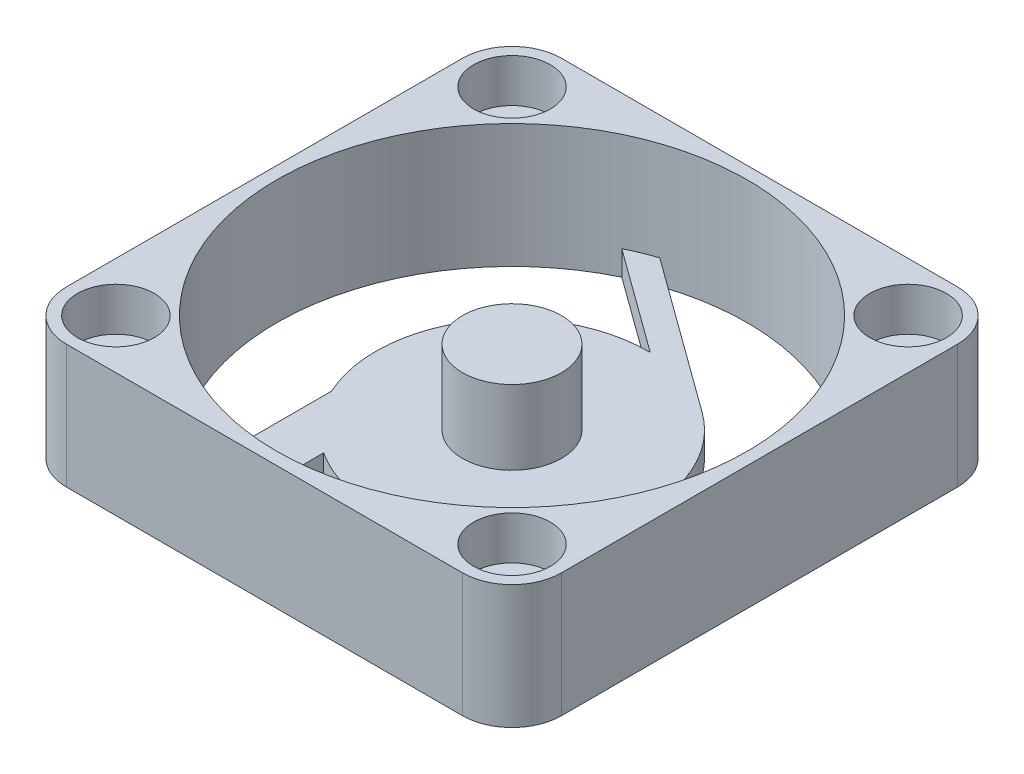
ISO-10303-21;
HEADER;
FILE_DESCRIPTION(('STEP AP214'),'2;1');
FILE_NAME('part.step','',(''),(''),'','','');
FILE_SCHEMA(('AUTOMOTIVE_DESIGN { 1 0 10303 214 1 1 1 1 }'));
ENDSEC;
DATA;
#1=APPLICATION_CONTEXT('core data for automotive mechanical design processes');
#2=APPLICATION_PROTOCOL_DEFINITION('international standard','automotive_design',2000,#1);
#3=PRODUCT_CONTEXT('',#1,'mechanical');
#4=PRODUCT('Part','Part','',(#3));
#5=PRODUCT_RELATED_PRODUCT_CATEGORY('part','',(#4));
#6=PRODUCT_DEFINITION_FORMATION('','',#4);
#7=PRODUCT_DEFINITION_CONTEXT('part definition',#1,'design');
#8=PRODUCT_DEFINITION('design','',#6,#7);
#9=PRODUCT_DEFINITION_SHAPE('','',#8);
#10=(LENGTH_UNIT() NAMED_UNIT(*) SI_UNIT(.MILLI.,.METRE.));
#11=(NAMED_UNIT(*) PLANE_ANGLE_UNIT() SI_UNIT($,.RADIAN.));
#12=(NAMED_UNIT(*) SI_UNIT($,.STERADIAN.) SOLID_ANGLE_UNIT());
#13=UNCERTAINTY_MEASURE_WITH_UNIT(LENGTH_MEASURE(1.E-05),#10,'distance_accuracy_value','');
#14=(GEOMETRIC_REPRESENTATION_CONTEXT(3) GLOBAL_UNCERTAINTY_ASSIGNED_CONTEXT((#13)) GLOBAL_UNIT_ASSIGNED_CONTEXT((#10,
#11,#12)) REPRESENTATION_CONTEXT('',''));
#15=CARTESIAN_POINT('',(0.,0.,0.));
#16=DIRECTION('',(0.,0.,1.));
#17=DIRECTION('',(1.,0.,0.));
#18=AXIS2_PLACEMENT_3D('',#15,#16,#17);
#19=CARTESIAN_POINT('',(0.,2.,0.));
#20=DIRECTION('',(0.,1.,0.));
#21=DIRECTION('',(0.,0.,1.));
#22=AXIS2_PLACEMENT_3D('',#19,#20,#21);
#23=PLANE('',#22);
#24=DIRECTION('',(-0.809016994374951,0.,-0.587785252292468));
#25=VECTOR('',#24,1.);
#26=CARTESIAN_POINT('',(-8.24737632897294,2.,-17.1166814449617));
#27=LINE('',#26,#25);
#28=CARTESIAN_POINT('',(0.173394534615489,2.,-10.9986332939764));
#29=VERTEX_POINT('',#28);
#30=CARTESIAN_POINT('',(-8.24737632897294,2.,-17.1166814449617));
#31=VERTEX_POINT('',#30);
#32=EDGE_CURVE('E189',#29,#31,#27,.T.);
#33=ORIENTED_EDGE('',*,*,#32,.F.);
#34=CARTESIAN_POINT('',(0.,2.,0.));
#35=DIRECTION('',(0.,-1.,0.));
#36=DIRECTION('',(0.,0.,1.));
#37=AXIS2_PLACEMENT_3D('',#34,#35,#36);
#38=CIRCLE('',#37,11.);
#39=CARTESIAN_POINT('',(-10.,2.,4.58257569495584));
#40=VERTEX_POINT('',#39);
#41=EDGE_CURVE('E173',#40,#29,#38,.T.);
#42=ORIENTED_EDGE('',*,*,#41,.F.);
#43=DIRECTION('',(0.,0.,-1.));
#44=VECTOR('',#43,1.);
#45=CARTESIAN_POINT('',(-10.,2.,4.58257569495584));
#46=LINE('',#45,#44);
#47=CARTESIAN_POINT('',(-10.,2.,16.1554944214035));
#48=VERTEX_POINT('',#47);
#49=EDGE_CURVE('E180',#48,#40,#46,.T.);
#50=ORIENTED_EDGE('',*,*,#49,.F.);
#51=CARTESIAN_POINT('',(0.,2.,0.));
#52=DIRECTION('',(0.,1.,0.));
#53=DIRECTION('',(0.,0.,1.));
#54=AXIS2_PLACEMENT_3D('',#51,#52,#53);
#55=CIRCLE('',#54,19.);
#56=CARTESIAN_POINT('',(-6.,2.,18.0277563773199));
#57=VERTEX_POINT('',#56);
#58=EDGE_CURVE('E246',#48,#57,#55,.T.);
#59=ORIENTED_EDGE('',*,*,#58,.T.);
#60=DIRECTION('',(0.,0.,1.));
#61=VECTOR('',#60,1.);
#62=CARTESIAN_POINT('',(-6.,2.,9.21954445729289));
#63=LINE('',#62,#61);
#64=CARTESIAN_POINT('',(-6.,2.,9.21954445729289));
#65=VERTEX_POINT('',#64);
#66=EDGE_CURVE('E211',#65,#57,#63,.T.);
#67=ORIENTED_EDGE('',*,*,#66,.F.);
#68=CARTESIAN_POINT('',(0.,2.,0.));
#69=DIRECTION('',(0.,-1.,0.));
#70=DIRECTION('',(0.,0.,1.));
#71=AXIS2_PLACEMENT_3D('',#68,#69,#70);
#72=CIRCLE('',#71,11.);
#73=CARTESIAN_POINT('',(5.49999999999999,2.,9.52627944162883));
#74=VERTEX_POINT('',#73);
#75=EDGE_CURVE('E208',#74,#65,#72,.T.);
#76=ORIENTED_EDGE('',*,*,#75,.F.);
#77=DIRECTION('',(-0.866025403784439,0.,0.499999999999999));
#78=VECTOR('',#77,1.);
#79=CARTESIAN_POINT('',(5.49999999999999,2.,9.52627944162883));
#80=LINE('',#79,#78);
#81=CARTESIAN_POINT('',(18.9164078649987,2.,1.78031274921401));
#82=VERTEX_POINT('',#81);
#83=EDGE_CURVE('E205',#82,#74,#80,.T.);
#84=ORIENTED_EDGE('',*,*,#83,.F.);
#85=CARTESIAN_POINT('',(18.9913767461894,2.,-0.572371631280806));
#86=VERTEX_POINT('',#85);
#87=EDGE_CURVE('E243',#82,#86,#55,.T.);
#88=ORIENTED_EDGE('',*,*,#87,.T.);
#89=DIRECTION('',(0.866025403784438,0.,-0.5));
#90=VECTOR('',#89,1.);
#91=CARTESIAN_POINT('',(18.9913767461894,2.,-0.572371631280806));
#92=LINE('',#91,#90);
#93=CARTESIAN_POINT('',(9.97722557505166,2.,4.63195097389157));
#94=VERTEX_POINT('',#93);
#95=EDGE_CURVE('E263',#94,#86,#92,.T.);
#96=ORIENTED_EDGE('',*,*,#95,.F.);
#97=CARTESIAN_POINT('',(0.,2.,0.));
#98=DIRECTION('',(0.,-1.,0.));
#99=DIRECTION('',(0.,0.,1.));
#100=AXIS2_PLACEMENT_3D('',#97,#98,#99);
#101=CIRCLE('',#100,11.);
#102=CARTESIAN_POINT('',(6.46563777521722,2.,-8.89918693812441));
#103=VERTEX_POINT('',#102);
#104=EDGE_CURVE('E235',#103,#94,#101,.T.);
#105=ORIENTED_EDGE('',*,*,#104,.F.);
#106=DIRECTION('',(0.809016994374947,0.,0.587785252292474));
#107=VECTOR('',#106,1.);
#108=CARTESIAN_POINT('',(6.46563777521722,2.,-8.89918693812441));
#109=LINE('',#108,#107);
#110=CARTESIAN_POINT('',(-6.06759960883458,2.,-18.0051169112247));
#111=VERTEX_POINT('',#110);
#112=EDGE_CURVE('E232',#111,#103,#109,.T.);
#113=ORIENTED_EDGE('',*,*,#112,.F.);
#114=EDGE_CURVE('E252',#111,#31,#55,.T.);
#115=ORIENTED_EDGE('',*,*,#114,.T.);
#116=EDGE_LOOP('',(#33,#42,#50,#59,#67,#76,#84,#88,#96,#105,#113,#115));
#117=FACE_BOUND('',#116,.T.);
#118=CARTESIAN_POINT('',(0.,2.,0.));
#119=DIRECTION('',(0.,1.,0.));
#120=DIRECTION('',(0.,0.,1.));
#121=AXIS2_PLACEMENT_3D('',#118,#119,#120);
#122=CIRCLE('',#121,4.);
#123=CARTESIAN_POINT('',(0.,2.,4.));
#124=VERTEX_POINT('',#123);
#125=EDGE_CURVE('E527',#124,#124,#122,.T.);
#126=ORIENTED_EDGE('',*,*,#125,.F.);
#127=EDGE_LOOP('',(#126));
#128=FACE_BOUND('',#127,.T.);
#129=ADVANCED_FACE('F34',(#117,#128),#23,.T.);
#130=CARTESIAN_POINT('',(-16.,-2.50000000007189E-05,16.));
#131=DIRECTION('',(0.,1.,0.));
#132=DIRECTION('',(0.,0.,1.));
#133=AXIS2_PLACEMENT_3D('',#130,#131,#132);
#134=CYLINDRICAL_SURFACE('',#133,1.75);
#135=CARTESIAN_POINT('',(-16.,0.,16.));
#136=DIRECTION('',(0.,-1.,0.));
#137=DIRECTION('',(0.,0.,-1.));
#138=AXIS2_PLACEMENT_3D('',#135,#136,#137);
#139=CIRCLE('',#138,1.75);
#140=CARTESIAN_POINT('',(-16.,0.,14.25));
#141=VERTEX_POINT('',#140);
#142=EDGE_CURVE('E572',#141,#141,#139,.T.);
#143=ORIENTED_EDGE('',*,*,#142,.T.);
#144=EDGE_LOOP('',(#143));
#145=FACE_BOUND('',#144,.T.);
#146=CARTESIAN_POINT('',(-16.,6.5,16.));
#147=DIRECTION('',(0.,1.,0.));
#148=DIRECTION('',(0.,0.,1.));
#149=AXIS2_PLACEMENT_3D('',#146,#147,#148);
#150=CIRCLE('',#149,1.75);
#151=CARTESIAN_POINT('',(-16.,6.5,17.75));
#152=VERTEX_POINT('',#151);
#153=EDGE_CURVE('E38',#152,#152,#150,.F.);
#154=ORIENTED_EDGE('',*,*,#153,.F.);
#155=EDGE_LOOP('',(#154));
#156=FACE_BOUND('',#155,.T.);
#157=ADVANCED_FACE('F392',(#145,#156),#134,.F.);
#158=CARTESIAN_POINT('',(16.,-2.50000000007189E-05,16.));
#159=DIRECTION('',(0.,1.,0.));
#160=DIRECTION('',(0.,0.,1.));
#161=AXIS2_PLACEMENT_3D('',#158,#159,#160);
#162=CYLINDRICAL_SURFACE('',#161,1.75);
#163=CARTESIAN_POINT('',(16.,0.,16.));
#164=DIRECTION('',(0.,-1.,0.));
#165=DIRECTION('',(0.,0.,-1.));
#166=AXIS2_PLACEMENT_3D('',#163,#164,#165);
#167=CIRCLE('',#166,1.75);
#168=CARTESIAN_POINT('',(16.,0.,14.25));
#169=VERTEX_POINT('',#168);
#170=EDGE_CURVE('E569',#169,#169,#167,.T.);
#171=ORIENTED_EDGE('',*,*,#170,.T.);
#172=EDGE_LOOP('',(#171));
#173=FACE_BOUND('',#172,.T.);
#174=CARTESIAN_POINT('',(16.,6.5,16.));
#175=DIRECTION('',(0.,1.,0.));
#176=DIRECTION('',(0.,0.,1.));
#177=AXIS2_PLACEMENT_3D('',#174,#175,#176);
#178=CIRCLE('',#177,1.75);
#179=CARTESIAN_POINT('',(16.,6.5,17.75));
#180=VERTEX_POINT('',#179);
#181=EDGE_CURVE('E540',#180,#180,#178,.F.);
#182=ORIENTED_EDGE('',*,*,#181,.F.);
#183=EDGE_LOOP('',(#182));
#184=FACE_BOUND('',#183,.T.);
#185=ADVANCED_FACE('F397',(#173,#184),#162,.F.);
#186=CARTESIAN_POINT('',(16.,-2.50000000007189E-05,-16.));
#187=DIRECTION('',(0.,1.,0.));
#188=DIRECTION('',(0.,0.,1.));
#189=AXIS2_PLACEMENT_3D('',#186,#187,#188);
#190=CYLINDRICAL_SURFACE('',#189,1.75);
#191=CARTESIAN_POINT('',(16.,0.,-16.));
#192=DIRECTION('',(0.,-1.,0.));
#193=DIRECTION('',(0.,0.,-1.));
#194=AXIS2_PLACEMENT_3D('',#191,#192,#193);
#195=CIRCLE('',#194,1.75);
#196=CARTESIAN_POINT('',(16.,0.,-17.75));
#197=VERTEX_POINT('',#196);
#198=EDGE_CURVE('E575',#197,#197,#195,.T.);
#199=ORIENTED_EDGE('',*,*,#198,.T.);
#200=EDGE_LOOP('',(#199));
#201=FACE_BOUND('',#200,.T.);
#202=CARTESIAN_POINT('',(16.,6.5,-16.));
#203=DIRECTION('',(0.,1.,0.));
#204=DIRECTION('',(0.,0.,1.));
#205=AXIS2_PLACEMENT_3D('',#202,#203,#204);
#206=CIRCLE('',#205,1.75);
#207=CARTESIAN_POINT('',(16.,6.5,-14.25));
#208=VERTEX_POINT('',#207);
#209=EDGE_CURVE('E547',#208,#208,#206,.F.);
#210=ORIENTED_EDGE('',*,*,#209,.F.);
#211=EDGE_LOOP('',(#210));
#212=FACE_BOUND('',#211,.T.);
#213=ADVANCED_FACE('F469',(#201,#212),#190,.F.);
#214=CARTESIAN_POINT('',(-16.,-2.50000000007189E-05,-16.));
#215=DIRECTION('',(0.,1.,0.));
#216=DIRECTION('',(0.,0.,1.));
#217=AXIS2_PLACEMENT_3D('',#214,#215,#216);
#218=CYLINDRICAL_SURFACE('',#217,1.75);
#219=CARTESIAN_POINT('',(-16.,0.,-16.));
#220=DIRECTION('',(0.,-1.,0.));
#221=DIRECTION('',(0.,0.,-1.));
#222=AXIS2_PLACEMENT_3D('',#219,#220,#221);
#223=CIRCLE('',#222,1.75);
#224=CARTESIAN_POINT('',(-16.,0.,-17.75));
#225=VERTEX_POINT('',#224);
#226=EDGE_CURVE('E184',#225,#225,#223,.T.);
#227=ORIENTED_EDGE('',*,*,#226,.T.);
#228=EDGE_LOOP('',(#227));
#229=FACE_BOUND('',#228,.T.);
#230=CARTESIAN_POINT('',(-16.,6.5,-16.));
#231=DIRECTION('',(0.,1.,0.));
#232=DIRECTION('',(0.,0.,1.));
#233=AXIS2_PLACEMENT_3D('',#230,#231,#232);
#234=CIRCLE('',#233,1.75);
#235=CARTESIAN_POINT('',(-16.,6.5,-14.25));
#236=VERTEX_POINT('',#235);
#237=EDGE_CURVE('E553',#236,#236,#234,.F.);
#238=ORIENTED_EDGE('',*,*,#237,.F.);
#239=EDGE_LOOP('',(#238));
#240=FACE_BOUND('',#239,.T.);
#241=ADVANCED_FACE('F441',(#229,#240),#218,.F.);
#242=CARTESIAN_POINT('',(-16.,10.,16.));
#243=DIRECTION('',(0.,-1.,0.));
#244=DIRECTION('',(0.,0.,-1.));
#245=AXIS2_PLACEMENT_3D('',#242,#243,#244);
#246=CYLINDRICAL_SURFACE('',#245,4.);
#247=CARTESIAN_POINT('',(-16.,0.,16.));
#248=DIRECTION('',(0.,1.,0.));
#249=DIRECTION('',(0.,0.,-1.));
#250=AXIS2_PLACEMENT_3D('',#247,#248,#249);
#251=CIRCLE('',#250,4.);
#252=CARTESIAN_POINT('',(-20.,0.,16.));
#253=VERTEX_POINT('',#252);
#254=CARTESIAN_POINT('',(-16.,0.,20.));
#255=VERTEX_POINT('',#254);
#256=EDGE_CURVE('E256',#253,#255,#251,.T.);
#257=ORIENTED_EDGE('',*,*,#256,.T.);
#258=DIRECTION('',(0.,-1.,0.));
#259=VECTOR('',#258,1.);
#260=CARTESIAN_POINT('',(-16.,10.,20.));
#261=LINE('',#260,#259);
#262=CARTESIAN_POINT('',(-16.,10.,20.));
#263=VERTEX_POINT('',#262);
#264=EDGE_CURVE('E333',#263,#255,#261,.T.);
#265=ORIENTED_EDGE('',*,*,#264,.F.);
#266=CARTESIAN_POINT('',(-16.,10.,16.));
#267=DIRECTION('',(0.,1.,0.));
#268=DIRECTION('',(0.,0.,-1.));
#269=AXIS2_PLACEMENT_3D('',#266,#267,#268);
#270=CIRCLE('',#269,4.);
#271=CARTESIAN_POINT('',(-20.,10.,16.));
#272=VERTEX_POINT('',#271);
#273=EDGE_CURVE('E279',#272,#263,#270,.T.);
#274=ORIENTED_EDGE('',*,*,#273,.F.);
#275=DIRECTION('',(0.,-1.,0.));
#276=VECTOR('',#275,1.);
#277=CARTESIAN_POINT('',(-20.,10.,16.));
#278=LINE('',#277,#276);
#279=EDGE_CURVE('E297',#272,#253,#278,.T.);
#280=ORIENTED_EDGE('',*,*,#279,.T.);
#281=EDGE_LOOP('',(#257,#265,#274,#280));
#282=FACE_BOUND('',#281,.T.);
#283=ADVANCED_FACE('F36',(#282),#246,.T.);
#284=CARTESIAN_POINT('',(16.,10.,20.));
#285=DIRECTION('',(0.,0.,-1.));
#286=DIRECTION('',(-1.,0.,0.));
#287=AXIS2_PLACEMENT_3D('',#284,#285,#286);
#288=PLANE('',#287);
#289=DIRECTION('',(1.,0.,0.));
#290=VECTOR('',#289,1.);
#291=CARTESIAN_POINT('',(16.,0.,20.));
#292=LINE('',#291,#290);
#293=CARTESIAN_POINT('',(16.,0.,20.));
#294=VERTEX_POINT('',#293);
#295=EDGE_CURVE('E300',#255,#294,#292,.T.);
#296=ORIENTED_EDGE('',*,*,#295,.T.);
#297=DIRECTION('',(0.,-1.,0.));
#298=VECTOR('',#297,1.);
#299=CARTESIAN_POINT('',(16.,10.,20.));
#300=LINE('',#299,#298);
#301=CARTESIAN_POINT('',(16.,10.,20.));
#302=VERTEX_POINT('',#301);
#303=EDGE_CURVE('E330',#302,#294,#300,.T.);
#304=ORIENTED_EDGE('',*,*,#303,.F.);
#305=DIRECTION('',(1.,0.,0.));
#306=VECTOR('',#305,1.);
#307=CARTESIAN_POINT('',(16.,10.,20.));
#308=LINE('',#307,#306);
#309=EDGE_CURVE('E282',#263,#302,#308,.T.);
#310=ORIENTED_EDGE('',*,*,#309,.F.);
#311=ORIENTED_EDGE('',*,*,#264,.T.);
#312=EDGE_LOOP('',(#296,#304,#310,#311));
#313=FACE_BOUND('',#312,.T.);
#314=ADVANCED_FACE('F434',(#313),#288,.F.);
#315=CARTESIAN_POINT('',(16.,10.,16.));
#316=DIRECTION('',(0.,-1.,0.));
#317=DIRECTION('',(0.,0.,-1.));
#318=AXIS2_PLACEMENT_3D('',#315,#316,#317);
#319=CYLINDRICAL_SURFACE('',#318,4.);
#320=CARTESIAN_POINT('',(16.,0.,16.));
#321=DIRECTION('',(0.,1.,0.));
#322=DIRECTION('',(0.,0.,1.));
#323=AXIS2_PLACEMENT_3D('',#320,#321,#322);
#324=CIRCLE('',#323,4.);
#325=CARTESIAN_POINT('',(20.,0.,16.));
#326=VERTEX_POINT('',#325);
#327=EDGE_CURVE('E302',#294,#326,#324,.T.);
#328=ORIENTED_EDGE('',*,*,#327,.T.);
#329=DIRECTION('',(0.,-1.,0.));
#330=VECTOR('',#329,1.);
#331=CARTESIAN_POINT('',(20.,10.,16.));
#332=LINE('',#331,#330);
#333=CARTESIAN_POINT('',(20.,10.,16.));
#334=VERTEX_POINT('',#333);
#335=EDGE_CURVE('E327',#334,#326,#332,.T.);
#336=ORIENTED_EDGE('',*,*,#335,.F.);
#337=CARTESIAN_POINT('',(16.,10.,16.));
#338=DIRECTION('',(0.,1.,0.));
#339=DIRECTION('',(0.,0.,1.));
#340=AXIS2_PLACEMENT_3D('',#337,#338,#339);
#341=CIRCLE('',#340,4.);
#342=EDGE_CURVE('E285',#302,#334,#341,.T.);
#343=ORIENTED_EDGE('',*,*,#342,.F.);
#344=ORIENTED_EDGE('',*,*,#303,.T.);
#345=EDGE_LOOP('',(#328,#336,#343,#344));
#346=FACE_BOUND('',#345,.T.);
#347=ADVANCED_FACE('F431',(#346),#319,.T.);
#348=CARTESIAN_POINT('',(20.,10.,16.));
#349=DIRECTION('',(-1.,0.,0.));
#350=DIRECTION('',(0.,0.,1.));
#351=AXIS2_PLACEMENT_3D('',#348,#349,#350);
#352=PLANE('',#351);
#353=DIRECTION('',(0.,0.,-1.));
#354=VECTOR('',#353,1.);
#355=CARTESIAN_POINT('',(20.,0.,16.));
#356=LINE('',#355,#354);
#357=CARTESIAN_POINT('',(20.,0.,-16.));
#358=VERTEX_POINT('',#357);
#359=EDGE_CURVE('E304',#326,#358,#356,.T.);
#360=ORIENTED_EDGE('',*,*,#359,.T.);
#361=DIRECTION('',(0.,-1.,0.));
#362=VECTOR('',#361,1.);
#363=CARTESIAN_POINT('',(20.,10.,-16.));
#364=LINE('',#363,#362);
#365=CARTESIAN_POINT('',(20.,10.,-16.));
#366=VERTEX_POINT('',#365);
#367=EDGE_CURVE('E324',#366,#358,#364,.T.);
#368=ORIENTED_EDGE('',*,*,#367,.F.);
#369=DIRECTION('',(0.,0.,-1.));
#370=VECTOR('',#369,1.);
#371=CARTESIAN_POINT('',(20.,10.,16.));
#372=LINE('',#371,#370);
#373=EDGE_CURVE('E287',#334,#366,#372,.T.);
#374=ORIENTED_EDGE('',*,*,#373,.F.);
#375=ORIENTED_EDGE('',*,*,#335,.T.);
#376=EDGE_LOOP('',(#360,#368,#374,#375));
#377=FACE_BOUND('',#376,.T.);
#378=ADVANCED_FACE('F427',(#377),#352,.F.);
#379=CARTESIAN_POINT('',(16.,10.,-16.));
#380=DIRECTION('',(0.,-1.,0.));
#381=DIRECTION('',(0.,0.,-1.));
#382=AXIS2_PLACEMENT_3D('',#379,#380,#381);
#383=CYLINDRICAL_SURFACE('',#382,4.);
#384=CARTESIAN_POINT('',(16.,0.,-16.));
#385=DIRECTION('',(0.,1.,0.));
#386=DIRECTION('',(0.,0.,1.));
#387=AXIS2_PLACEMENT_3D('',#384,#385,#386);
#388=CIRCLE('',#387,4.);
#389=CARTESIAN_POINT('',(16.,0.,-20.));
#390=VERTEX_POINT('',#389);
#391=EDGE_CURVE('E306',#358,#390,#388,.T.);
#392=ORIENTED_EDGE('',*,*,#391,.T.);
#393=DIRECTION('',(0.,-1.,0.));
#394=VECTOR('',#393,1.);
#395=CARTESIAN_POINT('',(16.,10.,-20.));
#396=LINE('',#395,#394);
#397=CARTESIAN_POINT('',(16.,10.,-20.));
#398=VERTEX_POINT('',#397);
#399=EDGE_CURVE('E321',#398,#390,#396,.T.);
#400=ORIENTED_EDGE('',*,*,#399,.F.);
#401=CARTESIAN_POINT('',(16.,10.,-16.));
#402=DIRECTION('',(0.,1.,0.));
#403=DIRECTION('',(0.,0.,1.));
#404=AXIS2_PLACEMENT_3D('',#401,#402,#403);
#405=CIRCLE('',#404,4.);
#406=EDGE_CURVE('E289',#366,#398,#405,.T.);
#407=ORIENTED_EDGE('',*,*,#406,.F.);
#408=ORIENTED_EDGE('',*,*,#367,.T.);
#409=EDGE_LOOP('',(#392,#400,#407,#408));
#410=FACE_BOUND('',#409,.T.);
#411=ADVANCED_FACE('F423',(#410),#383,.T.);
#412=CARTESIAN_POINT('',(16.,10.,-20.));
#413=DIRECTION('',(0.,0.,1.));
#414=DIRECTION('',(1.,0.,0.));
#415=AXIS2_PLACEMENT_3D('',#412,#413,#414);
#416=PLANE('',#415);
#417=DIRECTION('',(-1.,0.,0.));
#418=VECTOR('',#417,1.);
#419=CARTESIAN_POINT('',(16.,0.,-20.));
#420=LINE('',#419,#418);
#421=CARTESIAN_POINT('',(-16.,0.,-20.));
#422=VERTEX_POINT('',#421);
#423=EDGE_CURVE('E308',#390,#422,#420,.T.);
#424=ORIENTED_EDGE('',*,*,#423,.T.);
#425=DIRECTION('',(0.,-1.,0.));
#426=VECTOR('',#425,1.);
#427=CARTESIAN_POINT('',(-16.,10.,-20.));
#428=LINE('',#427,#426);
#429=CARTESIAN_POINT('',(-16.,10.,-20.));
#430=VERTEX_POINT('',#429);
#431=EDGE_CURVE('E318',#430,#422,#428,.T.);
#432=ORIENTED_EDGE('',*,*,#431,.F.);
#433=DIRECTION('',(-1.,0.,0.));
#434=VECTOR('',#433,1.);
#435=CARTESIAN_POINT('',(16.,10.,-20.));
#436=LINE('',#435,#434);
#437=EDGE_CURVE('E291',#398,#430,#436,.T.);
#438=ORIENTED_EDGE('',*,*,#437,.F.);
#439=ORIENTED_EDGE('',*,*,#399,.T.);
#440=EDGE_LOOP('',(#424,#432,#438,#439));
#441=FACE_BOUND('',#440,.T.);
#442=ADVANCED_FACE('F419',(#441),#416,.F.);
#443=CARTESIAN_POINT('',(-16.,10.,-16.));
#444=DIRECTION('',(0.,-1.,0.));
#445=DIRECTION('',(0.,0.,-1.));
#446=AXIS2_PLACEMENT_3D('',#443,#444,#445);
#447=CYLINDRICAL_SURFACE('',#446,4.);
#448=CARTESIAN_POINT('',(-16.,0.,-16.));
#449=DIRECTION('',(0.,1.,0.));
#450=DIRECTION('',(0.,0.,1.));
#451=AXIS2_PLACEMENT_3D('',#448,#449,#450);
#452=CIRCLE('',#451,4.);
#453=CARTESIAN_POINT('',(-20.,0.,-16.));
#454=VERTEX_POINT('',#453);
#455=EDGE_CURVE('E310',#422,#454,#452,.T.);
#456=ORIENTED_EDGE('',*,*,#455,.T.);
#457=DIRECTION('',(0.,-1.,0.));
#458=VECTOR('',#457,1.);
#459=CARTESIAN_POINT('',(-20.,10.,-16.));
#460=LINE('',#459,#458);
#461=CARTESIAN_POINT('',(-20.,10.,-16.));
#462=VERTEX_POINT('',#461);
#463=EDGE_CURVE('E315',#462,#454,#460,.T.);
#464=ORIENTED_EDGE('',*,*,#463,.F.);
#465=CARTESIAN_POINT('',(-16.,10.,-16.));
#466=DIRECTION('',(0.,1.,0.));
#467=DIRECTION('',(0.,0.,1.));
#468=AXIS2_PLACEMENT_3D('',#465,#466,#467);
#469=CIRCLE('',#468,4.);
#470=EDGE_CURVE('E293',#430,#462,#469,.T.);
#471=ORIENTED_EDGE('',*,*,#470,.F.);
#472=ORIENTED_EDGE('',*,*,#431,.T.);
#473=EDGE_LOOP('',(#456,#464,#471,#472));
#474=FACE_BOUND('',#473,.T.);
#475=ADVANCED_FACE('F415',(#474),#447,.T.);
#476=CARTESIAN_POINT('',(-20.,10.,16.));
#477=DIRECTION('',(1.,0.,0.));
#478=DIRECTION('',(0.,0.,-1.));
#479=AXIS2_PLACEMENT_3D('',#476,#477,#478);
#480=PLANE('',#479);
#481=DIRECTION('',(0.,0.,1.));
#482=VECTOR('',#481,1.);
#483=CARTESIAN_POINT('',(-20.,0.,16.));
#484=LINE('',#483,#482);
#485=EDGE_CURVE('E283',#454,#253,#484,.T.);
#486=ORIENTED_EDGE('',*,*,#485,.T.);
#487=ORIENTED_EDGE('',*,*,#279,.F.);
#488=DIRECTION('',(0.,0.,1.));
#489=VECTOR('',#488,1.);
#490=CARTESIAN_POINT('',(-20.,10.,16.));
#491=LINE('',#490,#489);
#492=EDGE_CURVE('E295',#462,#272,#491,.T.);
#493=ORIENTED_EDGE('',*,*,#492,.F.);
#494=ORIENTED_EDGE('',*,*,#463,.T.);
#495=EDGE_LOOP('',(#486,#487,#493,#494));
#496=FACE_BOUND('',#495,.T.);
#497=ADVANCED_FACE('F408',(#496),#480,.F.);
#498=CARTESIAN_POINT('',(-16.,10.,16.));
#499=DIRECTION('',(0.,-1.,0.));
#500=DIRECTION('',(0.,0.,-1.));
#501=AXIS2_PLACEMENT_3D('',#498,#499,#500);
#502=PLANE('',#501);
#503=CARTESIAN_POINT('',(-16.,10.,16.));
#504=DIRECTION('',(0.,1.,0.));
#505=DIRECTION('',(0.,0.,1.));
#506=AXIS2_PLACEMENT_3D('',#503,#504,#505);
#507=CIRCLE('',#506,3.1);
#508=CARTESIAN_POINT('',(-16.,10.,19.1));
#509=VERTEX_POINT('',#508);
#510=EDGE_CURVE('E526',#509,#509,#507,.T.);
#511=ORIENTED_EDGE('',*,*,#510,.F.);
#512=EDGE_LOOP('',(#511));
#513=FACE_BOUND('',#512,.T.);
#514=CARTESIAN_POINT('',(16.,10.,16.));
#515=DIRECTION('',(0.,1.,0.));
#516=DIRECTION('',(0.,0.,1.));
#517=AXIS2_PLACEMENT_3D('',#514,#515,#516);
#518=CIRCLE('',#517,3.1);
#519=CARTESIAN_POINT('',(16.,10.,19.1));
#520=VERTEX_POINT('',#519);
#521=EDGE_CURVE('E541',#520,#520,#518,.T.);
#522=ORIENTED_EDGE('',*,*,#521,.F.);
#523=EDGE_LOOP('',(#522));
#524=FACE_BOUND('',#523,.T.);
#525=CARTESIAN_POINT('',(16.,10.,-16.));
#526=DIRECTION('',(0.,1.,0.));
#527=DIRECTION('',(0.,0.,1.));
#528=AXIS2_PLACEMENT_3D('',#525,#526,#527);
#529=CIRCLE('',#528,3.1);
#530=CARTESIAN_POINT('',(16.,10.,-12.9));
#531=VERTEX_POINT('',#530);
#532=EDGE_CURVE('E548',#531,#531,#529,.T.);
#533=ORIENTED_EDGE('',*,*,#532,.F.);
#534=EDGE_LOOP('',(#533));
#535=FACE_BOUND('',#534,.T.);
#536=CARTESIAN_POINT('',(-16.,10.,-16.));
#537=DIRECTION('',(0.,1.,0.));
#538=DIRECTION('',(0.,0.,1.));
#539=AXIS2_PLACEMENT_3D('',#536,#537,#538);
#540=CIRCLE('',#539,3.1);
#541=CARTESIAN_POINT('',(-16.,10.,-12.9));
#542=VERTEX_POINT('',#541);
#543=EDGE_CURVE('E554',#542,#542,#540,.T.);
#544=ORIENTED_EDGE('',*,*,#543,.F.);
#545=EDGE_LOOP('',(#544));
#546=FACE_BOUND('',#545,.T.);
#547=CARTESIAN_POINT('',(0.,10.,0.));
#548=DIRECTION('',(0.,1.,0.));
#549=DIRECTION('',(0.,0.,1.));
#550=AXIS2_PLACEMENT_3D('',#547,#548,#549);
#551=CIRCLE('',#550,19.);
#552=CARTESIAN_POINT('',(0.,10.,19.));
#553=VERTEX_POINT('',#552);
#554=EDGE_CURVE('E247',#553,#553,#551,.T.);
#555=ORIENTED_EDGE('',*,*,#554,.F.);
#556=EDGE_LOOP('',(#555));
#557=FACE_BOUND('',#556,.T.);
#558=ORIENTED_EDGE('',*,*,#273,.T.);
#559=ORIENTED_EDGE('',*,*,#309,.T.);
#560=ORIENTED_EDGE('',*,*,#342,.T.);
#561=ORIENTED_EDGE('',*,*,#373,.T.);
#562=ORIENTED_EDGE('',*,*,#406,.T.);
#563=ORIENTED_EDGE('',*,*,#437,.T.);
#564=ORIENTED_EDGE('',*,*,#470,.T.);
#565=ORIENTED_EDGE('',*,*,#492,.T.);
#566=EDGE_LOOP('',(#558,#559,#560,#561,#562,#563,#564,#565));
#567=FACE_BOUND('',#566,.T.);
#568=ADVANCED_FACE('F405',(#513,#524,#535,#546,#557,#567),#502,.F.);
#569=CARTESIAN_POINT('',(-16.,0.,16.));
#570=DIRECTION('',(0.,-1.,0.));
#571=DIRECTION('',(0.,0.,-1.));
#572=AXIS2_PLACEMENT_3D('',#569,#570,#571);
#573=PLANE('',#572);
#574=ORIENTED_EDGE('',*,*,#170,.F.);
#575=EDGE_LOOP('',(#574));
#576=FACE_BOUND('',#575,.T.);
#577=ORIENTED_EDGE('',*,*,#142,.F.);
#578=EDGE_LOOP('',(#577));
#579=FACE_BOUND('',#578,.T.);
#580=ORIENTED_EDGE('',*,*,#198,.F.);
#581=EDGE_LOOP('',(#580));
#582=FACE_BOUND('',#581,.T.);
#583=ORIENTED_EDGE('',*,*,#226,.F.);
#584=EDGE_LOOP('',(#583));
#585=FACE_BOUND('',#584,.T.);
#586=CARTESIAN_POINT('',(0.,0.,0.));
#587=DIRECTION('',(0.,-1.,0.));
#588=DIRECTION('',(0.,0.,-1.));
#589=AXIS2_PLACEMENT_3D('',#586,#587,#588);
#590=CIRCLE('',#589,19.);
#591=CARTESIAN_POINT('',(-10.,0.,16.1554944214035));
#592=VERTEX_POINT('',#591);
#593=CARTESIAN_POINT('',(-8.24737632897294,0.,-17.1166814449617));
#594=VERTEX_POINT('',#593);
#595=EDGE_CURVE('E203',#592,#594,#590,.T.);
#596=ORIENTED_EDGE('',*,*,#595,.F.);
#597=DIRECTION('',(0.,0.,1.));
#598=VECTOR('',#597,1.);
#599=CARTESIAN_POINT('',(-10.,0.,16.));
#600=LINE('',#599,#598);
#601=CARTESIAN_POINT('',(-10.,0.,4.58257569495584));
#602=VERTEX_POINT('',#601);
#603=EDGE_CURVE('E196',#602,#592,#600,.T.);
#604=ORIENTED_EDGE('',*,*,#603,.F.);
#605=CARTESIAN_POINT('',(0.,0.,0.));
#606=DIRECTION('',(0.,-1.,0.));
#607=DIRECTION('',(0.,0.,-1.));
#608=AXIS2_PLACEMENT_3D('',#605,#606,#607);
#609=CIRCLE('',#608,11.);
#610=CARTESIAN_POINT('',(0.173394534615489,0.,-10.9986332939764));
#611=VERTEX_POINT('',#610);
#612=EDGE_CURVE('E176',#611,#602,#609,.F.);
#613=ORIENTED_EDGE('',*,*,#612,.F.);
#614=DIRECTION('',(0.809016994374951,0.,0.587785252292468));
#615=VECTOR('',#614,1.);
#616=CARTESIAN_POINT('',(2.42638344599382,0.,-9.36174103473553));
#617=LINE('',#616,#615);
#618=EDGE_CURVE('E201',#594,#611,#617,.T.);
#619=ORIENTED_EDGE('',*,*,#618,.F.);
#620=EDGE_LOOP('',(#596,#604,#613,#619));
#621=FACE_BOUND('',#620,.T.);
#622=CARTESIAN_POINT('',(0.,0.,0.));
#623=DIRECTION('',(0.,-1.,0.));
#624=DIRECTION('',(0.,0.,-1.));
#625=AXIS2_PLACEMENT_3D('',#622,#623,#624);
#626=CIRCLE('',#625,19.);
#627=CARTESIAN_POINT('',(18.9164078649987,0.,1.78031274921401));
#628=VERTEX_POINT('',#627);
#629=CARTESIAN_POINT('',(-6.,0.,18.0277563773199));
#630=VERTEX_POINT('',#629);
#631=EDGE_CURVE('E230',#628,#630,#626,.T.);
#632=ORIENTED_EDGE('',*,*,#631,.F.);
#633=DIRECTION('',(0.866025403784439,0.,-0.499999999999999));
#634=VECTOR('',#633,1.);
#635=CARTESIAN_POINT('',(-13.4282032302755,0.,20.4544826719043));
#636=LINE('',#635,#634);
#637=CARTESIAN_POINT('',(5.49999999999999,0.,9.52627944162883));
#638=VERTEX_POINT('',#637);
#639=EDGE_CURVE('E218',#638,#628,#636,.T.);
#640=ORIENTED_EDGE('',*,*,#639,.F.);
#641=CARTESIAN_POINT('',(0.,0.,0.));
#642=DIRECTION('',(0.,-1.,0.));
#643=DIRECTION('',(0.,0.,-1.));
#644=AXIS2_PLACEMENT_3D('',#641,#642,#643);
#645=CIRCLE('',#644,11.);
#646=CARTESIAN_POINT('',(-6.,0.,9.21954445729289));
#647=VERTEX_POINT('',#646);
#648=EDGE_CURVE('E225',#647,#638,#645,.F.);
#649=ORIENTED_EDGE('',*,*,#648,.F.);
#650=DIRECTION('',(0.,0.,-1.));
#651=VECTOR('',#650,1.);
#652=CARTESIAN_POINT('',(-6.,0.,16.));
#653=LINE('',#652,#651);
#654=EDGE_CURVE('E228',#630,#647,#653,.T.);
#655=ORIENTED_EDGE('',*,*,#654,.F.);
#656=EDGE_LOOP('',(#632,#640,#649,#655));
#657=FACE_BOUND('',#656,.T.);
#658=CARTESIAN_POINT('',(0.,0.,0.));
#659=DIRECTION('',(0.,-1.,0.));
#660=DIRECTION('',(0.,0.,-1.));
#661=AXIS2_PLACEMENT_3D('',#658,#659,#660);
#662=CIRCLE('',#661,19.);
#663=CARTESIAN_POINT('',(-6.06759960883458,0.,-18.0051169112247));
#664=VERTEX_POINT('',#663);
#665=CARTESIAN_POINT('',(18.9913767461894,0.,-0.572371631280806));
#666=VERTEX_POINT('',#665);
#667=EDGE_CURVE('E11',#664,#666,#662,.T.);
#668=ORIENTED_EDGE('',*,*,#667,.F.);
#669=DIRECTION('',(-0.809016994374947,0.,-0.587785252292474));
#670=VECTOR('',#669,1.);
#671=CARTESIAN_POINT('',(3.60195395057889,0.,-10.9797750234852));
#672=LINE('',#671,#670);
#673=CARTESIAN_POINT('',(6.46563777521722,0.,-8.89918693812442));
#674=VERTEX_POINT('',#673);
#675=EDGE_CURVE('E336',#674,#664,#672,.T.);
#676=ORIENTED_EDGE('',*,*,#675,.F.);
#677=CARTESIAN_POINT('',(0.,0.,0.));
#678=DIRECTION('',(0.,-1.,0.));
#679=DIRECTION('',(0.,0.,-1.));
#680=AXIS2_PLACEMENT_3D('',#677,#678,#679);
#681=CIRCLE('',#680,11.);
#682=CARTESIAN_POINT('',(9.97722557505166,0.,4.63195097389157));
#683=VERTEX_POINT('',#682);
#684=EDGE_CURVE('E338',#683,#674,#681,.F.);
#685=ORIENTED_EDGE('',*,*,#684,.F.);
#686=DIRECTION('',(-0.866025403784439,0.,0.5));
#687=VECTOR('',#686,1.);
#688=CARTESIAN_POINT('',(-14.4282032302755,0.,18.7224318643355));
#689=LINE('',#688,#687);
#690=EDGE_CURVE('E43',#666,#683,#689,.T.);
#691=ORIENTED_EDGE('',*,*,#690,.F.);
#692=EDGE_LOOP('',(#668,#676,#685,#691));
#693=FACE_BOUND('',#692,.T.);
#694=ORIENTED_EDGE('',*,*,#256,.F.);
#695=ORIENTED_EDGE('',*,*,#485,.F.);
#696=ORIENTED_EDGE('',*,*,#455,.F.);
#697=ORIENTED_EDGE('',*,*,#423,.F.);
#698=ORIENTED_EDGE('',*,*,#391,.F.);
#699=ORIENTED_EDGE('',*,*,#359,.F.);
#700=ORIENTED_EDGE('',*,*,#327,.F.);
#701=ORIENTED_EDGE('',*,*,#295,.F.);
#702=EDGE_LOOP('',(#694,#695,#696,#697,#698,#699,#700,#701));
#703=FACE_BOUND('',#702,.T.);
#704=ADVANCED_FACE('F351',(#576,#579,#582,#585,#621,#657,#693,#703),#573,.T.);
#705=CARTESIAN_POINT('',(0.,2.,0.));
#706=DIRECTION('',(0.,1.,0.));
#707=DIRECTION('',(0.,0.,1.));
#708=AXIS2_PLACEMENT_3D('',#705,#706,#707);
#709=CYLINDRICAL_SURFACE('',#708,19.);
#710=ORIENTED_EDGE('',*,*,#114,.F.);
#711=DIRECTION('',(0.,1.,0.));
#712=VECTOR('',#711,1.);
#713=CARTESIAN_POINT('',(-6.06759960883458,-7.,-18.0051169112247));
#714=LINE('',#713,#712);
#715=EDGE_CURVE('E266',#664,#111,#714,.T.);
#716=ORIENTED_EDGE('',*,*,#715,.F.);
#717=ORIENTED_EDGE('',*,*,#667,.T.);
#718=DIRECTION('',(0.,1.,0.));
#719=VECTOR('',#718,1.);
#720=CARTESIAN_POINT('',(18.9913767461894,-7.,-0.572371631280806));
#721=LINE('',#720,#719);
#722=EDGE_CURVE('E257',#666,#86,#721,.T.);
#723=ORIENTED_EDGE('',*,*,#722,.T.);
#724=ORIENTED_EDGE('',*,*,#87,.F.);
#725=DIRECTION('',(0.,1.,0.));
#726=VECTOR('',#725,1.);
#727=CARTESIAN_POINT('',(18.9164078649987,-7.,1.78031274921401));
#728=LINE('',#727,#726);
#729=EDGE_CURVE('E214',#628,#82,#728,.T.);
#730=ORIENTED_EDGE('',*,*,#729,.F.);
#731=ORIENTED_EDGE('',*,*,#631,.T.);
#732=DIRECTION('',(0.,1.,0.));
#733=VECTOR('',#732,1.);
#734=CARTESIAN_POINT('',(-6.,-7.,18.0277563773199));
#735=LINE('',#734,#733);
#736=EDGE_CURVE('E215',#630,#57,#735,.T.);
#737=ORIENTED_EDGE('',*,*,#736,.T.);
#738=ORIENTED_EDGE('',*,*,#58,.F.);
#739=DIRECTION('',(0.,1.,0.));
#740=VECTOR('',#739,1.);
#741=CARTESIAN_POINT('',(-10.,-7.,16.1554944214035));
#742=LINE('',#741,#740);
#743=EDGE_CURVE('E56',#592,#48,#742,.T.);
#744=ORIENTED_EDGE('',*,*,#743,.F.);
#745=ORIENTED_EDGE('',*,*,#595,.T.);
#746=DIRECTION('',(0.,1.,0.));
#747=VECTOR('',#746,1.);
#748=CARTESIAN_POINT('',(-8.24737632897294,-7.,-17.1166814449617));
#749=LINE('',#748,#747);
#750=EDGE_CURVE('E194',#594,#31,#749,.T.);
#751=ORIENTED_EDGE('',*,*,#750,.T.);
#752=EDGE_LOOP('',(#710,#716,#717,#723,#724,#730,#731,#737,#738,#744,#745,#751));
#753=FACE_BOUND('',#752,.T.);
#754=ORIENTED_EDGE('',*,*,#554,.T.);
#755=EDGE_LOOP('',(#754));
#756=FACE_BOUND('',#755,.T.);
#757=ADVANCED_FACE('F356',(#753,#756),#709,.F.);
#758=CARTESIAN_POINT('',(18.9913767461894,-7.,-0.572371631280806));
#759=DIRECTION('',(0.5,0.,0.866025403784439));
#760=DIRECTION('',(0.866025403784439,0.,-0.5));
#761=AXIS2_PLACEMENT_3D('',#758,#759,#760);
#762=PLANE('',#761);
#763=ORIENTED_EDGE('',*,*,#690,.T.);
#764=DIRECTION('',(0.,1.,0.));
#765=VECTOR('',#764,1.);
#766=CARTESIAN_POINT('',(9.97722557505166,-7.,4.63195097389157));
#767=LINE('',#766,#765);
#768=EDGE_CURVE('E260',#683,#94,#767,.T.);
#769=ORIENTED_EDGE('',*,*,#768,.T.);
#770=ORIENTED_EDGE('',*,*,#95,.T.);
#771=ORIENTED_EDGE('',*,*,#722,.F.);
#772=EDGE_LOOP('',(#763,#769,#770,#771));
#773=FACE_BOUND('',#772,.T.);
#774=ADVANCED_FACE('F343',(#773),#762,.F.);
#775=CARTESIAN_POINT('',(0.,-7.,0.));
#776=DIRECTION('',(0.,1.,0.));
#777=DIRECTION('',(0.,0.,1.));
#778=AXIS2_PLACEMENT_3D('',#775,#776,#777);
#779=CYLINDRICAL_SURFACE('',#778,11.);
#780=ORIENTED_EDGE('',*,*,#684,.T.);
#781=DIRECTION('',(0.,1.,0.));
#782=VECTOR('',#781,1.);
#783=CARTESIAN_POINT('',(6.46563777521722,-7.,-8.89918693812441));
#784=LINE('',#783,#782);
#785=EDGE_CURVE('E268',#674,#103,#784,.T.);
#786=ORIENTED_EDGE('',*,*,#785,.T.);
#787=ORIENTED_EDGE('',*,*,#104,.T.);
#788=ORIENTED_EDGE('',*,*,#768,.F.);
#789=EDGE_LOOP('',(#780,#786,#787,#788));
#790=FACE_BOUND('',#789,.T.);
#791=ADVANCED_FACE('F348',(#790),#779,.T.);
#792=CARTESIAN_POINT('',(6.46563777521722,-7.,-8.89918693812441));
#793=DIRECTION('',(-0.587785252292474,0.,0.809016994374947));
#794=DIRECTION('',(0.809016994374947,0.,0.587785252292474));
#795=AXIS2_PLACEMENT_3D('',#792,#793,#794);
#796=PLANE('',#795);
#797=ORIENTED_EDGE('',*,*,#675,.T.);
#798=ORIENTED_EDGE('',*,*,#715,.T.);
#799=ORIENTED_EDGE('',*,*,#112,.T.);
#800=ORIENTED_EDGE('',*,*,#785,.F.);
#801=EDGE_LOOP('',(#797,#798,#799,#800));
#802=FACE_BOUND('',#801,.T.);
#803=ADVANCED_FACE('F353',(#802),#796,.F.);
#804=CARTESIAN_POINT('',(-6.,-7.,9.21954445729289));
#805=DIRECTION('',(-1.,0.,0.));
#806=DIRECTION('',(0.,0.,1.));
#807=AXIS2_PLACEMENT_3D('',#804,#805,#806);
#808=PLANE('',#807);
#809=ORIENTED_EDGE('',*,*,#654,.T.);
#810=DIRECTION('',(0.,1.,0.));
#811=VECTOR('',#810,1.);
#812=CARTESIAN_POINT('',(-6.,-7.,9.21954445729289));
#813=LINE('',#812,#811);
#814=EDGE_CURVE('E219',#647,#65,#813,.T.);
#815=ORIENTED_EDGE('',*,*,#814,.T.);
#816=ORIENTED_EDGE('',*,*,#66,.T.);
#817=ORIENTED_EDGE('',*,*,#736,.F.);
#818=EDGE_LOOP('',(#809,#815,#816,#817));
#819=FACE_BOUND('',#818,.T.);
#820=ADVANCED_FACE('F372',(#819),#808,.F.);
#821=CARTESIAN_POINT('',(0.,-7.,0.));
#822=DIRECTION('',(0.,1.,0.));
#823=DIRECTION('',(0.,0.,1.));
#824=AXIS2_PLACEMENT_3D('',#821,#822,#823);
#825=CYLINDRICAL_SURFACE('',#824,11.);
#826=ORIENTED_EDGE('',*,*,#648,.T.);
#827=DIRECTION('',(0.,1.,0.));
#828=VECTOR('',#827,1.);
#829=CARTESIAN_POINT('',(5.49999999999999,-7.,9.52627944162883));
#830=LINE('',#829,#828);
#831=EDGE_CURVE('E221',#638,#74,#830,.T.);
#832=ORIENTED_EDGE('',*,*,#831,.T.);
#833=ORIENTED_EDGE('',*,*,#75,.T.);
#834=ORIENTED_EDGE('',*,*,#814,.F.);
#835=EDGE_LOOP('',(#826,#832,#833,#834));
#836=FACE_BOUND('',#835,.T.);
#837=ADVANCED_FACE('F374',(#836),#825,.T.);
#838=CARTESIAN_POINT('',(5.49999999999999,-7.,9.52627944162883));
#839=DIRECTION('',(-0.499999999999999,0.,-0.866025403784439));
#840=DIRECTION('',(-0.866025403784439,0.,0.499999999999999));
#841=AXIS2_PLACEMENT_3D('',#838,#839,#840);
#842=PLANE('',#841);
#843=ORIENTED_EDGE('',*,*,#639,.T.);
#844=ORIENTED_EDGE('',*,*,#729,.T.);
#845=ORIENTED_EDGE('',*,*,#83,.T.);
#846=ORIENTED_EDGE('',*,*,#831,.F.);
#847=EDGE_LOOP('',(#843,#844,#845,#846));
#848=FACE_BOUND('',#847,.T.);
#849=ADVANCED_FACE('F382',(#848),#842,.F.);
#850=CARTESIAN_POINT('',(-8.24737632897294,-7.,-17.1166814449617));
#851=DIRECTION('',(0.587785252292468,0.,-0.809016994374951));
#852=DIRECTION('',(-0.809016994374951,0.,-0.587785252292468));
#853=AXIS2_PLACEMENT_3D('',#850,#851,#852);
#854=PLANE('',#853);
#855=ORIENTED_EDGE('',*,*,#618,.T.);
#856=DIRECTION('',(0.,1.,0.));
#857=VECTOR('',#856,1.);
#858=CARTESIAN_POINT('',(0.173394534615489,-7.,-10.9986332939764));
#859=LINE('',#858,#857);
#860=EDGE_CURVE('E178',#611,#29,#859,.T.);
#861=ORIENTED_EDGE('',*,*,#860,.T.);
#862=ORIENTED_EDGE('',*,*,#32,.T.);
#863=ORIENTED_EDGE('',*,*,#750,.F.);
#864=EDGE_LOOP('',(#855,#861,#862,#863));
#865=FACE_BOUND('',#864,.T.);
#866=ADVANCED_FACE('F380',(#865),#854,.F.);
#867=CARTESIAN_POINT('',(0.,-7.,0.));
#868=DIRECTION('',(0.,1.,0.));
#869=DIRECTION('',(0.,0.,1.));
#870=AXIS2_PLACEMENT_3D('',#867,#868,#869);
#871=CYLINDRICAL_SURFACE('',#870,11.);
#872=ORIENTED_EDGE('',*,*,#612,.T.);
#873=DIRECTION('',(0.,1.,0.));
#874=VECTOR('',#873,1.);
#875=CARTESIAN_POINT('',(-10.,-7.,4.58257569495584));
#876=LINE('',#875,#874);
#877=EDGE_CURVE('E51',#602,#40,#876,.T.);
#878=ORIENTED_EDGE('',*,*,#877,.T.);
#879=ORIENTED_EDGE('',*,*,#41,.T.);
#880=ORIENTED_EDGE('',*,*,#860,.F.);
#881=EDGE_LOOP('',(#872,#878,#879,#880));
#882=FACE_BOUND('',#881,.T.);
#883=ADVANCED_FACE('F170',(#882),#871,.T.);
#884=CARTESIAN_POINT('',(-10.,-7.,4.58257569495584));
#885=DIRECTION('',(1.,0.,0.));
#886=DIRECTION('',(0.,0.,-1.));
#887=AXIS2_PLACEMENT_3D('',#884,#885,#886);
#888=PLANE('',#887);
#889=ORIENTED_EDGE('',*,*,#603,.T.);
#890=ORIENTED_EDGE('',*,*,#743,.T.);
#891=ORIENTED_EDGE('',*,*,#49,.T.);
#892=ORIENTED_EDGE('',*,*,#877,.F.);
#893=EDGE_LOOP('',(#889,#890,#891,#892));
#894=FACE_BOUND('',#893,.T.);
#895=ADVANCED_FACE('F181',(#894),#888,.F.);
#896=CARTESIAN_POINT('',(-16.,6.5,-16.));
#897=DIRECTION('',(0.,1.,0.));
#898=DIRECTION('',(0.,0.,1.));
#899=AXIS2_PLACEMENT_3D('',#896,#897,#898);
#900=PLANE('',#899);
#901=CARTESIAN_POINT('',(-16.,6.5,-16.));
#902=DIRECTION('',(0.,1.,0.));
#903=DIRECTION('',(0.,0.,1.));
#904=AXIS2_PLACEMENT_3D('',#901,#902,#903);
#905=CIRCLE('',#904,3.1);
#906=CARTESIAN_POINT('',(-16.,6.5,-12.9));
#907=VERTEX_POINT('',#906);
#908=EDGE_CURVE('E551',#907,#907,#905,.T.);
#909=ORIENTED_EDGE('',*,*,#908,.T.);
#910=EDGE_LOOP('',(#909));
#911=FACE_BOUND('',#910,.T.);
#912=ORIENTED_EDGE('',*,*,#237,.T.);
#913=EDGE_LOOP('',(#912));
#914=FACE_BOUND('',#913,.T.);
#915=ADVANCED_FACE('F486',(#911,#914),#900,.T.);
#916=CARTESIAN_POINT('',(-16.,6.5,-16.));
#917=DIRECTION('',(0.,1.,0.));
#918=DIRECTION('',(0.,0.,1.));
#919=AXIS2_PLACEMENT_3D('',#916,#917,#918);
#920=CYLINDRICAL_SURFACE('',#919,3.1);
#921=ORIENTED_EDGE('',*,*,#908,.F.);
#922=EDGE_LOOP('',(#921));
#923=FACE_BOUND('',#922,.T.);
#924=ORIENTED_EDGE('',*,*,#543,.T.);
#925=EDGE_LOOP('',(#924));
#926=FACE_BOUND('',#925,.T.);
#927=ADVANCED_FACE('F482',(#923,#926),#920,.F.);
#928=CARTESIAN_POINT('',(16.,6.5,-16.));
#929=DIRECTION('',(0.,1.,0.));
#930=DIRECTION('',(0.,0.,1.));
#931=AXIS2_PLACEMENT_3D('',#928,#929,#930);
#932=PLANE('',#931);
#933=CARTESIAN_POINT('',(16.,6.5,-16.));
#934=DIRECTION('',(0.,1.,0.));
#935=DIRECTION('',(0.,0.,1.));
#936=AXIS2_PLACEMENT_3D('',#933,#934,#935);
#937=CIRCLE('',#936,3.1);
#938=CARTESIAN_POINT('',(16.,6.5,-12.9));
#939=VERTEX_POINT('',#938);
#940=EDGE_CURVE('E544',#939,#939,#937,.T.);
#941=ORIENTED_EDGE('',*,*,#940,.T.);
#942=EDGE_LOOP('',(#941));
#943=FACE_BOUND('',#942,.T.);
#944=ORIENTED_EDGE('',*,*,#209,.T.);
#945=EDGE_LOOP('',(#944));
#946=FACE_BOUND('',#945,.T.);
#947=ADVANCED_FACE('F485',(#943,#946),#932,.T.);
#948=CARTESIAN_POINT('',(16.,6.5,-16.));
#949=DIRECTION('',(0.,1.,0.));
#950=DIRECTION('',(0.,0.,1.));
#951=AXIS2_PLACEMENT_3D('',#948,#949,#950);
#952=CYLINDRICAL_SURFACE('',#951,3.1);
#953=ORIENTED_EDGE('',*,*,#940,.F.);
#954=EDGE_LOOP('',(#953));
#955=FACE_BOUND('',#954,.T.);
#956=ORIENTED_EDGE('',*,*,#532,.T.);
#957=EDGE_LOOP('',(#956));
#958=FACE_BOUND('',#957,.T.);
#959=ADVANCED_FACE('F491',(#955,#958),#952,.F.);
#960=CARTESIAN_POINT('',(16.,6.5,16.));
#961=DIRECTION('',(0.,1.,0.));
#962=DIRECTION('',(0.,0.,1.));
#963=AXIS2_PLACEMENT_3D('',#960,#961,#962);
#964=PLANE('',#963);
#965=CARTESIAN_POINT('',(16.,6.5,16.));
#966=DIRECTION('',(0.,1.,0.));
#967=DIRECTION('',(0.,0.,1.));
#968=AXIS2_PLACEMENT_3D('',#965,#966,#967);
#969=CIRCLE('',#968,3.1);
#970=CARTESIAN_POINT('',(16.,6.5,19.1));
#971=VERTEX_POINT('',#970);
#972=EDGE_CURVE('E537',#971,#971,#969,.T.);
#973=ORIENTED_EDGE('',*,*,#972,.T.);
#974=EDGE_LOOP('',(#973));
#975=FACE_BOUND('',#974,.T.);
#976=ORIENTED_EDGE('',*,*,#181,.T.);
#977=EDGE_LOOP('',(#976));
#978=FACE_BOUND('',#977,.T.);
#979=ADVANCED_FACE('F494',(#975,#978),#964,.T.);
#980=CARTESIAN_POINT('',(16.,6.5,16.));
#981=DIRECTION('',(0.,1.,0.));
#982=DIRECTION('',(0.,0.,1.));
#983=AXIS2_PLACEMENT_3D('',#980,#981,#982);
#984=CYLINDRICAL_SURFACE('',#983,3.1);
#985=ORIENTED_EDGE('',*,*,#972,.F.);
#986=EDGE_LOOP('',(#985));
#987=FACE_BOUND('',#986,.T.);
#988=ORIENTED_EDGE('',*,*,#521,.T.);
#989=EDGE_LOOP('',(#988));
#990=FACE_BOUND('',#989,.T.);
#991=ADVANCED_FACE('F499',(#987,#990),#984,.F.);
#992=CARTESIAN_POINT('',(-16.,6.5,16.));
#993=DIRECTION('',(0.,1.,0.));
#994=DIRECTION('',(0.,0.,1.));
#995=AXIS2_PLACEMENT_3D('',#992,#993,#994);
#996=PLANE('',#995);
#997=CARTESIAN_POINT('',(-16.,6.5,16.));
#998=DIRECTION('',(0.,1.,0.));
#999=DIRECTION('',(0.,0.,1.));
#1000=AXIS2_PLACEMENT_3D('',#997,#998,#999);
#1001=CIRCLE('',#1000,3.1);
#1002=CARTESIAN_POINT('',(-16.,6.5,19.1));
#1003=VERTEX_POINT('',#1002);
#1004=EDGE_CURVE('E530',#1003,#1003,#1001,.T.);
#1005=ORIENTED_EDGE('',*,*,#1004,.T.);
#1006=EDGE_LOOP('',(#1005));
#1007=FACE_BOUND('',#1006,.T.);
#1008=ORIENTED_EDGE('',*,*,#153,.T.);
#1009=EDGE_LOOP('',(#1008));
#1010=FACE_BOUND('',#1009,.T.);
#1011=ADVANCED_FACE('F502',(#1007,#1010),#996,.T.);
#1012=CARTESIAN_POINT('',(-16.,6.5,16.));
#1013=DIRECTION('',(0.,1.,0.));
#1014=DIRECTION('',(0.,0.,1.));
#1015=AXIS2_PLACEMENT_3D('',#1012,#1013,#1014);
#1016=CYLINDRICAL_SURFACE('',#1015,3.1);
#1017=ORIENTED_EDGE('',*,*,#1004,.F.);
#1018=EDGE_LOOP('',(#1017));
#1019=FACE_BOUND('',#1018,.T.);
#1020=ORIENTED_EDGE('',*,*,#510,.T.);
#1021=EDGE_LOOP('',(#1020));
#1022=FACE_BOUND('',#1021,.T.);
#1023=ADVANCED_FACE('F507',(#1019,#1022),#1016,.F.);
#1024=CARTESIAN_POINT('',(0.,8.,0.));
#1025=DIRECTION('',(0.,-1.,0.));
#1026=DIRECTION('',(0.,0.,-1.));
#1027=AXIS2_PLACEMENT_3D('',#1024,#1025,#1026);
#1028=CYLINDRICAL_SURFACE('',#1027,4.);
#1029=CARTESIAN_POINT('',(0.,8.,0.));
#1030=DIRECTION('',(0.,1.,0.));
#1031=DIRECTION('',(0.,0.,1.));
#1032=AXIS2_PLACEMENT_3D('',#1029,#1030,#1031);
#1033=CIRCLE('',#1032,4.);
#1034=CARTESIAN_POINT('',(0.,8.,4.));
#1035=VERTEX_POINT('',#1034);
#1036=EDGE_CURVE('E525',#1035,#1035,#1033,.T.);
#1037=ORIENTED_EDGE('',*,*,#1036,.F.);
#1038=EDGE_LOOP('',(#1037));
#1039=FACE_BOUND('',#1038,.T.);
#1040=ORIENTED_EDGE('',*,*,#125,.T.);
#1041=EDGE_LOOP('',(#1040));
#1042=FACE_BOUND('',#1041,.T.);
#1043=ADVANCED_FACE('F510',(#1039,#1042),#1028,.T.);
#1044=CARTESIAN_POINT('',(0.,8.,0.));
#1045=DIRECTION('',(0.,1.,0.));
#1046=DIRECTION('',(0.,0.,1.));
#1047=AXIS2_PLACEMENT_3D('',#1044,#1045,#1046);
#1048=PLANE('',#1047);
#1049=ORIENTED_EDGE('',*,*,#1036,.T.);
#1050=EDGE_LOOP('',(#1049));
#1051=FACE_BOUND('',#1050,.T.);
#1052=ADVANCED_FACE('F517',(#1051),#1048,.T.);
#1053=CLOSED_SHELL('',(#129,#157,#185,#213,#241,#283,#314,#347,#378,#411,#442,#475,#497,#568,
#704,#757,#774,#791,#803,#820,#837,#849,#866,#883,#895,#915,#927,#947,#959,#979,#991,#1011,
#1023,#1043,#1052));
#1054=MANIFOLD_SOLID_BREP('B2',#1053);
#1055=ADVANCED_BREP_SHAPE_REPRESENTATION('',(#18,#1054),#14);
#1056=SHAPE_DEFINITION_REPRESENTATION(#9,#1055);
ENDSEC;
END-ISO-10303-21;
